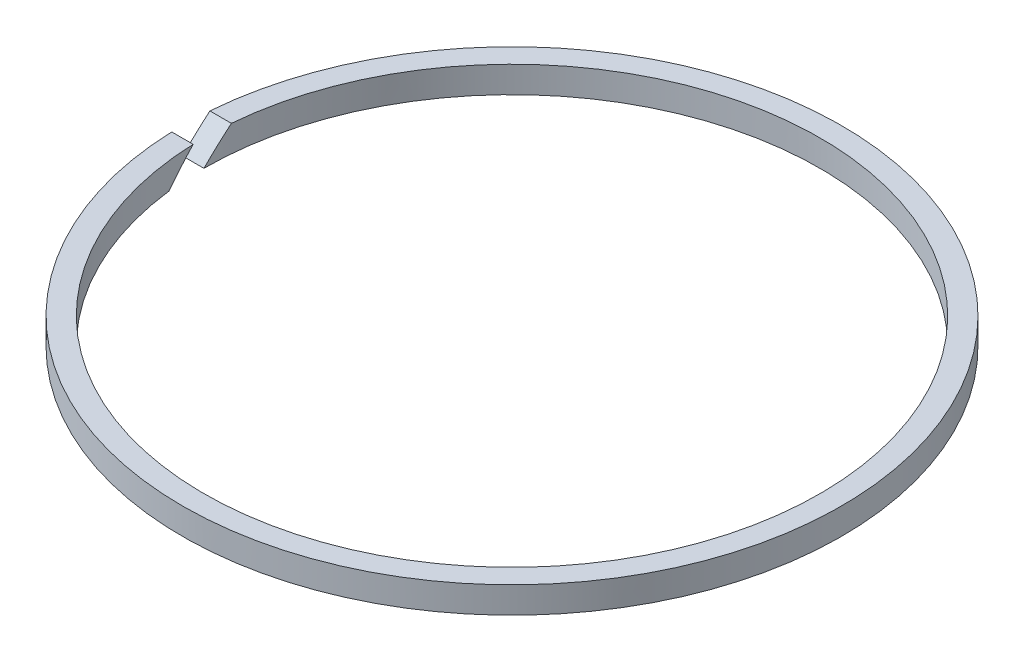
ISO-10303-21;
HEADER;
FILE_DESCRIPTION(('STEP AP214'),'2;1');
FILE_NAME('part.step','',(''),(''),'','','');
FILE_SCHEMA(('AUTOMOTIVE_DESIGN { 1 0 10303 214 1 1 1 1 }'));
ENDSEC;
DATA;
#1=APPLICATION_CONTEXT('core data for automotive mechanical design processes');
#2=APPLICATION_PROTOCOL_DEFINITION('international standard','automotive_design',2000,#1);
#3=PRODUCT_CONTEXT('',#1,'mechanical');
#4=PRODUCT('Part','Part','',(#3));
#5=PRODUCT_RELATED_PRODUCT_CATEGORY('part','',(#4));
#6=PRODUCT_DEFINITION_FORMATION('','',#4);
#7=PRODUCT_DEFINITION_CONTEXT('part definition',#1,'design');
#8=PRODUCT_DEFINITION('design','',#6,#7);
#9=PRODUCT_DEFINITION_SHAPE('','',#8);
#10=(LENGTH_UNIT() NAMED_UNIT(*) SI_UNIT(.MILLI.,.METRE.));
#11=(NAMED_UNIT(*) PLANE_ANGLE_UNIT() SI_UNIT($,.RADIAN.));
#12=(NAMED_UNIT(*) SI_UNIT($,.STERADIAN.) SOLID_ANGLE_UNIT());
#13=UNCERTAINTY_MEASURE_WITH_UNIT(LENGTH_MEASURE(1.E-05),#10,'distance_accuracy_value','');
#14=(GEOMETRIC_REPRESENTATION_CONTEXT(3) GLOBAL_UNCERTAINTY_ASSIGNED_CONTEXT((#13)) GLOBAL_UNIT_ASSIGNED_CONTEXT((#10,
#11,#12)) REPRESENTATION_CONTEXT('',''));
#15=CARTESIAN_POINT('',(0.,0.,0.));
#16=DIRECTION('',(0.,0.,1.));
#17=DIRECTION('',(1.,0.,0.));
#18=AXIS2_PLACEMENT_3D('',#15,#16,#17);
#19=CARTESIAN_POINT('',(0.,1.016,0.));
#20=DIRECTION('',(0.,1.,0.));
#21=DIRECTION('',(0.,0.,1.));
#22=AXIS2_PLACEMENT_3D('',#19,#20,#21);
#23=PLANE('',#22);
#24=DIRECTION('',(1.,0.,0.));
#25=VECTOR('',#24,1.);
#26=CARTESIAN_POINT('',(-12.701,1.016,0.420840979371066));
#27=LINE('',#26,#25);
#28=CARTESIAN_POINT('',(-12.6930253631702,1.016,0.420840979371066));
#29=VERTEX_POINT('',#28);
#30=CARTESIAN_POINT('',(-11.8670402004915,1.016,0.420840979371066));
#31=VERTEX_POINT('',#30);
#32=EDGE_CURVE('E68',#29,#31,#27,.T.);
#33=ORIENTED_EDGE('',*,*,#32,.F.);
#34=CARTESIAN_POINT('',(0.,1.016,0.));
#35=DIRECTION('',(0.,1.,0.));
#36=DIRECTION('',(0.,0.,1.));
#37=AXIS2_PLACEMENT_3D('',#34,#35,#36);
#38=CIRCLE('',#37,12.7);
#39=CARTESIAN_POINT('',(-12.6592947670871,1.016,-1.016));
#40=VERTEX_POINT('',#39);
#41=EDGE_CURVE('E99',#29,#40,#38,.T.);
#42=ORIENTED_EDGE('',*,*,#41,.T.);
#43=DIRECTION('',(1.,0.,0.));
#44=VECTOR('',#43,1.);
#45=CARTESIAN_POINT('',(-12.701,1.016,-1.016));
#46=LINE('',#45,#44);
#47=CARTESIAN_POINT('',(-11.8309549170809,1.016,-1.016));
#48=VERTEX_POINT('',#47);
#49=EDGE_CURVE('E84',#40,#48,#46,.T.);
#50=ORIENTED_EDGE('',*,*,#49,.T.);
#51=CARTESIAN_POINT('',(0.,1.016,0.));
#52=DIRECTION('',(0.,1.,0.));
#53=DIRECTION('',(0.,0.,1.));
#54=AXIS2_PLACEMENT_3D('',#51,#52,#53);
#55=CIRCLE('',#54,11.8745);
#56=EDGE_CURVE('E109',#31,#48,#55,.T.);
#57=ORIENTED_EDGE('',*,*,#56,.F.);
#58=EDGE_LOOP('',(#33,#42,#50,#57));
#59=FACE_BOUND('',#58,.T.);
#60=ADVANCED_FACE('F45',(#59),#23,.T.);
#61=CARTESIAN_POINT('',(0.,0.,0.));
#62=DIRECTION('',(0.,1.,0.));
#63=DIRECTION('',(0.,0.,1.));
#64=AXIS2_PLACEMENT_3D('',#61,#62,#63);
#65=PLANE('',#64);
#66=CARTESIAN_POINT('',(0.,0.,0.));
#67=DIRECTION('',(0.,1.,0.));
#68=DIRECTION('',(0.,0.,1.));
#69=AXIS2_PLACEMENT_3D('',#66,#67,#68);
#70=CIRCLE('',#69,12.7);
#71=CARTESIAN_POINT('',(-12.6184582259482,0.,1.43684097937106));
#72=VERTEX_POINT('',#71);
#73=CARTESIAN_POINT('',(-12.7,0.,0.));
#74=VERTEX_POINT('',#73);
#75=EDGE_CURVE('E101',#72,#74,#70,.T.);
#76=ORIENTED_EDGE('',*,*,#75,.F.);
#77=DIRECTION('',(1.,0.,0.));
#78=VECTOR('',#77,1.);
#79=CARTESIAN_POINT('',(-12.701,0.,1.43684097937106));
#80=LINE('',#79,#78);
#81=CARTESIAN_POINT('',(-11.7872489686949,0.,1.43684097937106));
#82=VERTEX_POINT('',#81);
#83=EDGE_CURVE('E118',#72,#82,#80,.T.);
#84=ORIENTED_EDGE('',*,*,#83,.T.);
#85=CARTESIAN_POINT('',(0.,0.,0.));
#86=DIRECTION('',(0.,1.,0.));
#87=DIRECTION('',(0.,0.,1.));
#88=AXIS2_PLACEMENT_3D('',#85,#86,#87);
#89=CIRCLE('',#88,11.8745);
#90=CARTESIAN_POINT('',(-11.8745,0.,0.));
#91=VERTEX_POINT('',#90);
#92=EDGE_CURVE('E103',#82,#91,#89,.T.);
#93=ORIENTED_EDGE('',*,*,#92,.T.);
#94=DIRECTION('',(1.,0.,0.));
#95=VECTOR('',#94,1.);
#96=CARTESIAN_POINT('',(-12.701,0.,0.));
#97=LINE('',#96,#95);
#98=EDGE_CURVE('E61',#74,#91,#97,.T.);
#99=ORIENTED_EDGE('',*,*,#98,.F.);
#100=EDGE_LOOP('',(#76,#84,#93,#99));
#101=FACE_BOUND('',#100,.T.);
#102=ADVANCED_FACE('F128',(#101),#65,.F.);
#103=CARTESIAN_POINT('',(0.,1.016,0.));
#104=DIRECTION('',(0.,-1.,0.));
#105=DIRECTION('',(0.,0.,-1.));
#106=AXIS2_PLACEMENT_3D('',#103,#104,#105);
#107=CYLINDRICAL_SURFACE('',#106,12.7);
#108=ORIENTED_EDGE('',*,*,#41,.F.);
#109=CARTESIAN_POINT('',(0.,1.43684097937107,0.));
#110=DIRECTION('',(0.,0.707106781186546,0.707106781186549));
#111=DIRECTION('',(0.,-0.707106781186549,0.707106781186546));
#112=AXIS2_PLACEMENT_3D('',#109,#110,#111);
#113=ELLIPSE('',#112,17.9605122421383,12.7);
#114=EDGE_CURVE('E93',#72,#29,#113,.F.);
#115=ORIENTED_EDGE('',*,*,#114,.F.);
#116=ORIENTED_EDGE('',*,*,#75,.T.);
#117=CARTESIAN_POINT('',(0.,0.,0.));
#118=DIRECTION('',(0.,-0.707106781186546,-0.707106781186549));
#119=DIRECTION('',(0.,-0.707106781186549,0.707106781186546));
#120=AXIS2_PLACEMENT_3D('',#117,#118,#119);
#121=ELLIPSE('',#120,17.9605122421383,12.7);
#122=EDGE_CURVE('E87',#40,#74,#121,.F.);
#123=ORIENTED_EDGE('',*,*,#122,.F.);
#124=EDGE_LOOP('',(#108,#115,#116,#123));
#125=FACE_BOUND('',#124,.T.);
#126=ADVANCED_FACE('F47',(#125),#107,.T.);
#127=CARTESIAN_POINT('',(0.,1.016,0.));
#128=DIRECTION('',(0.,-1.,0.));
#129=DIRECTION('',(0.,0.,-1.));
#130=AXIS2_PLACEMENT_3D('',#127,#128,#129);
#131=CYLINDRICAL_SURFACE('',#130,11.8745);
#132=CARTESIAN_POINT('',(0.,1.43684097937107,0.));
#133=DIRECTION('',(0.,0.707106781186546,0.707106781186549));
#134=DIRECTION('',(0.,-0.707106781186549,0.707106781186546));
#135=AXIS2_PLACEMENT_3D('',#132,#133,#134);
#136=ELLIPSE('',#135,16.7930789463994,11.8745);
#137=EDGE_CURVE('E11',#31,#82,#136,.T.);
#138=ORIENTED_EDGE('',*,*,#137,.F.);
#139=ORIENTED_EDGE('',*,*,#56,.T.);
#140=CARTESIAN_POINT('',(0.,0.,0.));
#141=DIRECTION('',(0.,-0.707106781186546,-0.707106781186549));
#142=DIRECTION('',(0.,-0.707106781186549,0.707106781186546));
#143=AXIS2_PLACEMENT_3D('',#140,#141,#142);
#144=ELLIPSE('',#143,16.7930789463994,11.8745);
#145=EDGE_CURVE('E54',#91,#48,#144,.T.);
#146=ORIENTED_EDGE('',*,*,#145,.F.);
#147=ORIENTED_EDGE('',*,*,#92,.F.);
#148=EDGE_LOOP('',(#138,#139,#146,#147));
#149=FACE_BOUND('',#148,.T.);
#150=ADVANCED_FACE('F131',(#149),#131,.F.);
#151=CARTESIAN_POINT('',(-12.701,0.,0.));
#152=DIRECTION('',(0.,-0.707106781186546,-0.707106781186549));
#153=DIRECTION('',(0.,0.707106781186549,-0.707106781186546));
#154=AXIS2_PLACEMENT_3D('',#151,#152,#153);
#155=PLANE('',#154);
#156=ORIENTED_EDGE('',*,*,#145,.T.);
#157=ORIENTED_EDGE('',*,*,#49,.F.);
#158=ORIENTED_EDGE('',*,*,#122,.T.);
#159=ORIENTED_EDGE('',*,*,#98,.T.);
#160=EDGE_LOOP('',(#156,#157,#158,#159));
#161=FACE_BOUND('',#160,.T.);
#162=ADVANCED_FACE('F86',(#161),#155,.F.);
#163=CARTESIAN_POINT('',(-12.701,1.016,0.420840979371066));
#164=DIRECTION('',(0.,0.707106781186546,0.707106781186549));
#165=DIRECTION('',(0.,-0.707106781186549,0.707106781186546));
#166=AXIS2_PLACEMENT_3D('',#163,#164,#165);
#167=PLANE('',#166);
#168=ORIENTED_EDGE('',*,*,#137,.T.);
#169=ORIENTED_EDGE('',*,*,#83,.F.);
#170=ORIENTED_EDGE('',*,*,#114,.T.);
#171=ORIENTED_EDGE('',*,*,#32,.T.);
#172=EDGE_LOOP('',(#168,#169,#170,#171));
#173=FACE_BOUND('',#172,.T.);
#174=ADVANCED_FACE('F126',(#173),#167,.F.);
#175=CLOSED_SHELL('',(#60,#102,#126,#150,#162,#174));
#176=MANIFOLD_SOLID_BREP('B2',#175);
#177=ADVANCED_BREP_SHAPE_REPRESENTATION('',(#18,#176),#14);
#178=SHAPE_DEFINITION_REPRESENTATION(#9,#177);
ENDSEC;
END-ISO-10303-21;
